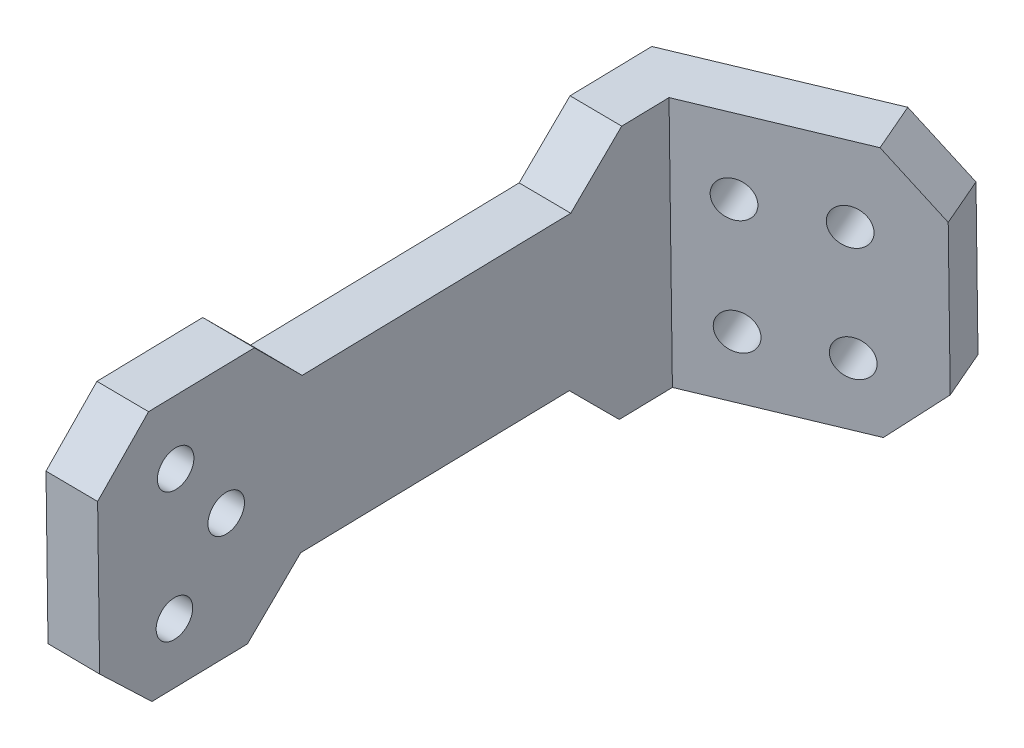
ISO-10303-21;
HEADER;
FILE_DESCRIPTION(('STEP AP214'),'2;1');
FILE_NAME('part.step','',(''),(''),'','','');
FILE_SCHEMA(('AUTOMOTIVE_DESIGN { 1 0 10303 214 1 1 1 1 }'));
ENDSEC;
DATA;
#1=APPLICATION_CONTEXT('core data for automotive mechanical design processes');
#2=APPLICATION_PROTOCOL_DEFINITION('international standard','automotive_design',2000,#1);
#3=PRODUCT_CONTEXT('',#1,'mechanical');
#4=PRODUCT('Part','Part','',(#3));
#5=PRODUCT_RELATED_PRODUCT_CATEGORY('part','',(#4));
#6=PRODUCT_DEFINITION_FORMATION('','',#4);
#7=PRODUCT_DEFINITION_CONTEXT('part definition',#1,'design');
#8=PRODUCT_DEFINITION('design','',#6,#7);
#9=PRODUCT_DEFINITION_SHAPE('','',#8);
#10=(LENGTH_UNIT() NAMED_UNIT(*) SI_UNIT(.MILLI.,.METRE.));
#11=(NAMED_UNIT(*) PLANE_ANGLE_UNIT() SI_UNIT($,.RADIAN.));
#12=(NAMED_UNIT(*) SI_UNIT($,.STERADIAN.) SOLID_ANGLE_UNIT());
#13=UNCERTAINTY_MEASURE_WITH_UNIT(LENGTH_MEASURE(1.E-05),#10,'distance_accuracy_value','');
#14=(GEOMETRIC_REPRESENTATION_CONTEXT(3) GLOBAL_UNCERTAINTY_ASSIGNED_CONTEXT((#13)) GLOBAL_UNIT_ASSIGNED_CONTEXT((#10,
#11,#12)) REPRESENTATION_CONTEXT('',''));
#15=CARTESIAN_POINT('',(0.,0.,0.));
#16=DIRECTION('',(0.,0.,1.));
#17=DIRECTION('',(1.,0.,0.));
#18=AXIS2_PLACEMENT_3D('',#15,#16,#17);
#19=CARTESIAN_POINT('',(0.677625199987656,71.7125158688856,1.62510661202803));
#20=DIRECTION('',(-0.00944634334495136,-0.999698722892989,-0.0226545810717298));
#21=DIRECTION('',(0.,-0.0226555919120575,0.999743329137591));
#22=AXIS2_PLACEMENT_3D('',#19,#20,#21);
#23=PLANE('',#22);
#24=DIRECTION('',(0.,0.0226555919120575,-0.999743329137591));
#25=VECTOR('',#24,1.);
#26=CARTESIAN_POINT('',(-79.7096790930301,74.4273959437813,-84.6574894141304));
#27=LINE('',#26,#25);
#28=CARTESIAN_POINT('',(-79.7096790930301,72.8806724105701,-16.403852945465));
#29=VERTEX_POINT('',#28);
#30=CARTESIAN_POINT('',(-79.7096790930301,73.1756143071616,-29.4190147097265));
#31=VERTEX_POINT('',#30);
#32=EDGE_CURVE('E297',#29,#31,#27,.T.);
#33=ORIENTED_EDGE('',*,*,#32,.F.);
#34=DIRECTION('',(-0.999955382303335,0.0094439187438584,0.000214012499884351));
#35=VECTOR('',#34,1.);
#36=CARTESIAN_POINT('',(-79.7096790930301,72.8806724105701,-16.403852945465));
#37=LINE('',#36,#35);
#38=CARTESIAN_POINT('',(-73.359962415404,72.8207035265466,-16.4052119248392));
#39=VERTEX_POINT('',#38);
#40=EDGE_CURVE('E252',#39,#29,#37,.T.);
#41=ORIENTED_EDGE('',*,*,#40,.F.);
#42=DIRECTION('',(0.,-0.0226555919120574,0.999743329137591));
#43=VECTOR('',#42,1.);
#44=CARTESIAN_POINT('',(-73.359962415404,72.676840517905,-10.0568417848155));
#45=LINE('',#44,#43);
#46=CARTESIAN_POINT('',(-73.359962415404,73.1156454231381,-29.4203736891007));
#47=VERTEX_POINT('',#46);
#48=EDGE_CURVE('E190',#47,#39,#45,.T.);
#49=ORIENTED_EDGE('',*,*,#48,.F.);
#50=DIRECTION('',(0.999955382303335,-0.00944391874385843,-0.000214012499883211));
#51=VECTOR('',#50,1.);
#52=CARTESIAN_POINT('',(0.677625199987693,72.4164092634002,-29.4362193653092));
#53=LINE('',#52,#51);
#54=EDGE_CURVE('E11',#31,#47,#53,.T.);
#55=ORIENTED_EDGE('',*,*,#54,.F.);
#56=EDGE_LOOP('',(#33,#41,#49,#55));
#57=FACE_BOUND('',#56,.T.);
#58=ADVANCED_FACE('F41',(#57),#23,.F.);
#59=CARTESIAN_POINT('',(-14.6991602759016,44.2871439133381,-167.493261540189));
#60=DIRECTION('',(0.00944634334495239,0.999698722892989,0.0226545810717298));
#61=DIRECTION('',(-0.999955376576697,0.00944634334495237,0.000107017596546688));
#62=AXIS2_PLACEMENT_3D('',#59,#60,#61);
#63=PLANE('',#62);
#64=DIRECTION('',(0.,-0.0226555919120575,0.999743329137591));
#65=VECTOR('',#64,1.);
#66=CARTESIAN_POINT('',(-80.0062344739473,43.0431846417096,-85.3686998448665));
#67=LINE('',#66,#65);
#68=CARTESIAN_POINT('',(-80.0062344739473,43.0431846417095,-85.3686998448665));
#69=VERTEX_POINT('',#68);
#70=CARTESIAN_POINT('',(-80.0062344739473,42.7991965757842,-74.6020228035035));
#71=VERTEX_POINT('',#70);
#72=EDGE_CURVE('E217',#69,#71,#67,.T.);
#73=ORIENTED_EDGE('',*,*,#72,.F.);
#74=DIRECTION('',(-0.922976587647694,0.,0.384856101230341));
#75=VECTOR('',#74,1.);
#76=CARTESIAN_POINT('',(-80.0062344739473,43.0431846417096,-85.3686998448665));
#77=LINE('',#76,#75);
#78=CARTESIAN_POINT('',(-57.7826837764154,43.0431846417096,-94.635315262214));
#79=VERTEX_POINT('',#78);
#80=EDGE_CURVE('E213',#79,#69,#77,.T.);
#81=ORIENTED_EDGE('',*,*,#80,.F.);
#82=DIRECTION('',(-0.384740152897546,0.0245451308027948,-0.922698515931529));
#83=VECTOR('',#82,1.);
#84=CARTESIAN_POINT('',(-57.7826837764154,43.0431846417096,-94.635315262214));
#85=LINE('',#84,#83);
#86=CARTESIAN_POINT('',(-55.339583805516,42.8873230611118,-88.7761796860488));
#87=VERTEX_POINT('',#86);
#88=EDGE_CURVE('E216',#87,#79,#85,.T.);
#89=ORIENTED_EDGE('',*,*,#88,.F.);
#90=DIRECTION('',(0.922976587647695,0.,-0.38485610123034));
#91=VECTOR('',#90,1.);
#92=CARTESIAN_POINT('',(-49.4786824739531,42.8873230611118,-91.2200159288615));
#93=LINE('',#92,#91);
#94=CARTESIAN_POINT('',(-73.6565177963211,42.8873230611118,-81.1385170448318));
#95=VERTEX_POINT('',#94);
#96=EDGE_CURVE('E203',#95,#87,#93,.T.);
#97=ORIENTED_EDGE('',*,*,#96,.F.);
#98=DIRECTION('',(0.,0.0226555919120575,-0.999743329137591));
#99=VECTOR('',#98,1.);
#100=CARTESIAN_POINT('',(-73.6565177963211,41.2926292158333,-10.7680522155516));
#101=LINE('',#100,#99);
#102=CARTESIAN_POINT('',(-73.6565177963211,42.7392276917607,-74.6033817828778));
#103=VERTEX_POINT('',#102);
#104=EDGE_CURVE('E285',#103,#95,#101,.T.);
#105=ORIENTED_EDGE('',*,*,#104,.F.);
#106=DIRECTION('',(0.999955382303335,-0.00944391874385943,-0.000214012499884219));
#107=VECTOR('',#106,1.);
#108=CARTESIAN_POINT('',(-14.6991602759016,42.1824143542566,-74.6159999573412));
#109=LINE('',#108,#107);
#110=EDGE_CURVE('E174',#71,#103,#109,.T.);
#111=ORIENTED_EDGE('',*,*,#110,.F.);
#112=EDGE_LOOP('',(#73,#81,#89,#97,#105,#111));
#113=FACE_BOUND('',#112,.T.);
#114=ADVANCED_FACE('F286',(#113),#63,.F.);
#115=CARTESIAN_POINT('',(-80.8710501892957,-48.4795490342398,-87.4427338938127));
#116=DIRECTION('',(-0.999955382303335,0.00944391874385943,0.000214012499884421));
#117=DIRECTION('',(-0.00944391896013155,-0.999955405202989,0.));
#118=AXIS2_PLACEMENT_3D('',#115,#116,#117);
#119=PLANE('',#118);
#120=DIRECTION('',(-0.00682918207909545,-0.707073818757855,-0.707106764993317));
#121=VECTOR('',#120,1.);
#122=CARTESIAN_POINT('',(-80.5773681736715,-16.662410896713,-119.261225933014));
#123=LINE('',#122,#121);
#124=CARTESIAN_POINT('',(-79.766958551444,67.2450643631087,-35.3498409888518));
#125=VERTEX_POINT('',#124);
#126=EDGE_CURVE('E324',#31,#125,#123,.T.);
#127=ORIENTED_EDGE('',*,*,#126,.T.);
#128=DIRECTION('',(0.,0.0226555919120577,-0.999743329137591));
#129=VECTOR('',#128,1.);
#130=CARTESIAN_POINT('',(-79.766958551444,68.365558115815,-84.7948591970185));
#131=LINE('',#130,#129);
#132=CARTESIAN_POINT('',(-79.766958551444,67.9939408277113,-68.3961746596216));
#133=VERTEX_POINT('',#132);
#134=EDGE_CURVE('E323',#125,#133,#131,.T.);
#135=ORIENTED_EDGE('',*,*,#134,.T.);
#136=DIRECTION('',(0.00652653619627499,0.707076677048495,-0.707106764993334));
#137=VECTOR('',#136,1.);
#138=CARTESIAN_POINT('',(-80.2166038918847,19.2799333346451,-19.6800942593051));
#139=LINE('',#138,#137);
#140=CARTESIAN_POINT('',(-79.7096790930301,74.1995249079103,-74.6020228035036));
#141=VERTEX_POINT('',#140);
#142=EDGE_CURVE('E321',#133,#141,#139,.T.);
#143=ORIENTED_EDGE('',*,*,#142,.T.);
#144=CARTESIAN_POINT('',(-79.7096790930301,74.4273959437813,-84.6574894141304));
#145=VERTEX_POINT('',#144);
#146=EDGE_CURVE('E172',#141,#145,#27,.T.);
#147=ORIENTED_EDGE('',*,*,#146,.T.);
#148=DIRECTION('',(0.00944634334495239,0.999698722892989,0.0226545810717298));
#149=VECTOR('',#148,1.);
#150=CARTESIAN_POINT('',(-80.8710501892957,-48.4795490342398,-87.4427338938127));
#151=LINE('',#150,#149);
#152=EDGE_CURVE('E189',#69,#145,#151,.T.);
#153=ORIENTED_EDGE('',*,*,#152,.F.);
#154=ORIENTED_EDGE('',*,*,#72,.T.);
#155=DIRECTION('',(0.00682918207909539,0.707073818757849,0.707106764993324));
#156=VECTOR('',#155,1.);
#157=CARTESIAN_POINT('',(-80.509043049518,-9.26015336031544,-126.66379845465));
#158=LINE('',#157,#156);
#159=CARTESIAN_POINT('',(-79.9462988757775,49.0047555704962,-68.3961746596215));
#160=VERTEX_POINT('',#159);
#161=EDGE_CURVE('E280',#71,#160,#158,.T.);
#162=ORIENTED_EDGE('',*,*,#161,.T.);
#163=DIRECTION('',(0.,-0.0226555919120575,0.999743329137591));
#164=VECTOR('',#163,1.);
#165=CARTESIAN_POINT('',(-79.9462988757775,49.3861195487064,-85.2249600062605));
#166=LINE('',#165,#164);
#167=CARTESIAN_POINT('',(-79.9462988757775,48.2558791058935,-35.3498409888517));
#168=VERTEX_POINT('',#167);
#169=EDGE_CURVE('E326',#160,#168,#166,.T.);
#170=ORIENTED_EDGE('',*,*,#169,.T.);
#171=DIRECTION('',(-0.00652653619627508,-0.707076677048504,0.707106764993325));
#172=VECTOR('',#171,1.);
#173=CARTESIAN_POINT('',(-80.1523426907388,25.9333527875086,-13.0263647891287));
#174=LINE('',#173,#172);
#175=CARTESIAN_POINT('',(-80.0062344739472,41.7625322039023,-28.8562177781239));
#176=VERTEX_POINT('',#175);
#177=EDGE_CURVE('E328',#168,#176,#174,.T.);
#178=ORIENTED_EDGE('',*,*,#177,.T.);
#179=CARTESIAN_POINT('',(-80.0062344739473,41.4964611084984,-17.115063376201));
#180=VERTEX_POINT('',#179);
#181=EDGE_CURVE('E292',#176,#180,#67,.T.);
#182=ORIENTED_EDGE('',*,*,#181,.T.);
#183=DIRECTION('',(-0.00667957343663225,-0.690873823428353,-0.722944495379966));
#184=VECTOR('',#183,1.);
#185=CARTESIAN_POINT('',(-80.761098739098,-36.5797762413307,-98.815634591854));
#186=LINE('',#185,#184);
#187=CARTESIAN_POINT('',(-79.9462501937068,47.7006849902273,-10.6228366463719));
#188=VERTEX_POINT('',#187);
#189=EDGE_CURVE('E247',#188,#180,#186,.T.);
#190=ORIENTED_EDGE('',*,*,#189,.F.);
#191=DIRECTION('',(0.00944634334495239,0.999698722892989,0.0226545810717298));
#192=VECTOR('',#191,1.);
#193=CARTESIAN_POINT('',(-80.8710501892957,-50.1701355760925,-12.8407272851236));
#194=LINE('',#193,#192);
#195=CARTESIAN_POINT('',(-79.7696633732706,66.388722511558,-10.1993393952467));
#196=VERTEX_POINT('',#195);
#197=EDGE_CURVE('E200',#188,#196,#194,.T.);
#198=ORIENTED_EDGE('',*,*,#197,.T.);
#199=DIRECTION('',(-0.00667957343663226,-0.722913668773976,0.690906079578444));
#200=VECTOR('',#199,1.);
#201=CARTESIAN_POINT('',(-79.9679082336864,44.9331728842632,10.3062483650945));
#202=LINE('',#201,#200);
#203=EDGE_CURVE('E244',#29,#196,#202,.T.);
#204=ORIENTED_EDGE('',*,*,#203,.F.);
#205=ORIENTED_EDGE('',*,*,#32,.T.);
#206=EDGE_LOOP('',(#127,#135,#143,#147,#153,#154,#162,#170,#178,#182,#190,#198,#204,#205));
#207=FACE_BOUND('',#206,.T.);
#208=CARTESIAN_POINT('',(-79.9357155551836,49.0243422093975,-19.810817403018));
#209=DIRECTION('',(0.999955382303335,-0.00944391874385943,-0.000214012499884421));
#210=DIRECTION('',(-0.00944391896013155,-0.999955405202989,0.));
#211=AXIS2_PLACEMENT_3D('',#208,#209,#210);
#212=CIRCLE('',#211,2.2479);
#213=CARTESIAN_POINT('',(-79.956944540614,46.7765424540417,-19.810817403018));
#214=VERTEX_POINT('',#213);
#215=EDGE_CURVE('E350',#214,#214,#212,.T.);
#216=ORIENTED_EDGE('',*,*,#215,.T.);
#217=EDGE_LOOP('',(#216));
#218=FACE_BOUND('',#217,.T.);
#219=CARTESIAN_POINT('',(-79.7842211516335,65.0651032882848,-19.8108174030179));
#220=DIRECTION('',(0.999955382303335,-0.00944391874385943,-0.000214012499884421));
#221=DIRECTION('',(-0.00944391896013155,-0.999955405202989,0.));
#222=AXIS2_PLACEMENT_3D('',#219,#220,#221);
#223=CIRCLE('',#222,2.2479);
#224=CARTESIAN_POINT('',(-79.805450137064,62.817303532929,-19.8108174030179));
#225=VERTEX_POINT('',#224);
#226=EDGE_CURVE('E347',#225,#225,#223,.T.);
#227=ORIENTED_EDGE('',*,*,#226,.T.);
#228=EDGE_LOOP('',(#227));
#229=FACE_BOUND('',#228,.T.);
#230=CARTESIAN_POINT('',(-79.8603841444811,57.143350836971,-26.105814993145));
#231=DIRECTION('',(0.999955382303335,-0.00944391874385943,-0.000214012499884421));
#232=DIRECTION('',(-0.00944391896013155,-0.999955405202989,0.));
#233=AXIS2_PLACEMENT_3D('',#230,#231,#232);
#234=CIRCLE('',#233,2.2479);
#235=CARTESIAN_POINT('',(-79.8816131299115,54.8955510816152,-26.105814993145));
#236=VERTEX_POINT('',#235);
#237=EDGE_CURVE('E339',#236,#236,#234,.T.);
#238=ORIENTED_EDGE('',*,*,#237,.T.);
#239=EDGE_LOOP('',(#238));
#240=FACE_BOUND('',#239,.T.);
#241=ADVANCED_FACE('F318',(#207,#218,#229,#240),#119,.T.);
#242=CARTESIAN_POINT('',(-80.8710501892957,-50.1701355760925,-12.8407272851236));
#243=DIRECTION('',(0.,-0.0226555919120575,0.999743329137591));
#244=DIRECTION('',(0.,0.999743329137591,0.0226555919120575));
#245=AXIS2_PLACEMENT_3D('',#242,#243,#244);
#246=PLANE('',#245);
#247=DIRECTION('',(0.00944634334495239,0.999698722892989,0.0226545810717298));
#248=VECTOR('',#247,1.);
#249=CARTESIAN_POINT('',(-74.5213335116696,-50.230104460116,-12.8420862644978));
#250=LINE('',#249,#248);
#251=CARTESIAN_POINT('',(-73.5965335160806,47.6407161062038,-10.6241956257461));
#252=VERTEX_POINT('',#251);
#253=CARTESIAN_POINT('',(-73.4199466956444,66.3287536275345,-10.200698374621));
#254=VERTEX_POINT('',#253);
#255=EDGE_CURVE('E204',#252,#254,#250,.T.);
#256=ORIENTED_EDGE('',*,*,#255,.T.);
#257=DIRECTION('',(0.999955382303335,-0.0094439187438584,-0.000214012499884351));
#258=VECTOR('',#257,1.);
#259=CARTESIAN_POINT('',(-73.4199466956444,66.3287536275345,-10.200698374621));
#260=LINE('',#259,#258);
#261=EDGE_CURVE('E239',#196,#254,#260,.T.);
#262=ORIENTED_EDGE('',*,*,#261,.F.);
#263=ORIENTED_EDGE('',*,*,#197,.F.);
#264=DIRECTION('',(-0.999955382303335,0.00944391874385943,0.000214012499884375));
#265=VECTOR('',#264,1.);
#266=CARTESIAN_POINT('',(-79.9462501937068,47.7006849902273,-10.6228366463719));
#267=LINE('',#266,#265);
#268=EDGE_CURVE('E242',#252,#188,#267,.T.);
#269=ORIENTED_EDGE('',*,*,#268,.F.);
#270=EDGE_LOOP('',(#256,#262,#263,#269));
#271=FACE_BOUND('',#270,.T.);
#272=ADVANCED_FACE('F405',(#271),#246,.T.);
#273=CARTESIAN_POINT('',(-74.5213335116696,-50.230104460116,-12.8420862644978));
#274=DIRECTION('',(0.999955382303335,-0.00944391874385944,-0.000214012499884224));
#275=DIRECTION('',(0.00944391896013156,0.999955405202989,0.));
#276=AXIS2_PLACEMENT_3D('',#273,#274,#275);
#277=PLANE('',#276);
#278=DIRECTION('',(0.00682918207909528,0.707073818757855,0.707106764993317));
#279=VECTOR('',#278,1.);
#280=CARTESIAN_POINT('',(-73.4172418738179,67.1850954790851,-35.3511999682261));
#281=LINE('',#280,#279);
#282=CARTESIAN_POINT('',(-73.4172418738179,67.1850954790851,-35.3511999682261));
#283=VERTEX_POINT('',#282);
#284=EDGE_CURVE('E494',#283,#47,#281,.T.);
#285=ORIENTED_EDGE('',*,*,#284,.T.);
#286=ORIENTED_EDGE('',*,*,#48,.T.);
#287=DIRECTION('',(0.0066795734366324,0.722913668773976,-0.690906079578444));
#288=VECTOR('',#287,1.);
#289=CARTESIAN_POINT('',(-73.970640103657,6.7285717098195,46.7606371341771));
#290=LINE('',#289,#288);
#291=EDGE_CURVE('E235',#254,#39,#290,.T.);
#292=ORIENTED_EDGE('',*,*,#291,.F.);
#293=ORIENTED_EDGE('',*,*,#255,.F.);
#294=DIRECTION('',(0.00667957343663211,0.690873823428353,0.722944495379966));
#295=VECTOR('',#294,1.);
#296=CARTESIAN_POINT('',(-74.0589335138751,-0.185699376786717,-60.670734710996));
#297=LINE('',#296,#295);
#298=CARTESIAN_POINT('',(-73.6565177963211,41.4364922244749,-17.1164223555753));
#299=VERTEX_POINT('',#298);
#300=EDGE_CURVE('E237',#299,#252,#297,.T.);
#301=ORIENTED_EDGE('',*,*,#300,.F.);
#302=CARTESIAN_POINT('',(-73.6565177963211,41.7025633198788,-28.8575767574982));
#303=VERTEX_POINT('',#302);
#304=EDGE_CURVE('E289',#299,#303,#101,.T.);
#305=ORIENTED_EDGE('',*,*,#304,.T.);
#306=DIRECTION('',(0.00652653619627541,0.707076677048504,-0.707106764993324));
#307=VECTOR('',#306,1.);
#308=CARTESIAN_POINT('',(-73.5965821981513,48.19591022187,-35.3511999682259));
#309=LINE('',#308,#307);
#310=CARTESIAN_POINT('',(-73.5965821981513,48.19591022187,-35.3511999682259));
#311=VERTEX_POINT('',#310);
#312=EDGE_CURVE('E481',#303,#311,#309,.T.);
#313=ORIENTED_EDGE('',*,*,#312,.T.);
#314=DIRECTION('',(0.,0.0226555919120575,-0.999743329137591));
#315=VECTOR('',#314,1.);
#316=CARTESIAN_POINT('',(-73.5965821981513,48.9447866864727,-68.3975336389957));
#317=LINE('',#316,#315);
#318=CARTESIAN_POINT('',(-73.5965821981513,48.9447866864727,-68.3975336389957));
#319=VERTEX_POINT('',#318);
#320=EDGE_CURVE('E483',#311,#319,#317,.T.);
#321=ORIENTED_EDGE('',*,*,#320,.T.);
#322=DIRECTION('',(-0.00682918207909415,-0.707073818757849,-0.707106764993324));
#323=VECTOR('',#322,1.);
#324=CARTESIAN_POINT('',(-73.6565177963211,42.7392276917607,-74.6033817828778));
#325=LINE('',#324,#323);
#326=EDGE_CURVE('E277',#319,#103,#325,.T.);
#327=ORIENTED_EDGE('',*,*,#326,.T.);
#328=ORIENTED_EDGE('',*,*,#104,.T.);
#329=DIRECTION('',(0.00944634334495239,0.999698722892989,0.0226545810717298));
#330=VECTOR('',#329,1.);
#331=CARTESIAN_POINT('',(-74.5213335116696,-48.6354106148375,-83.2125510937781));
#332=LINE('',#331,#330);
#333=CARTESIAN_POINT('',(-73.3599624154039,74.2715343631835,-80.4273066140957));
#334=VERTEX_POINT('',#333);
#335=EDGE_CURVE('E188',#95,#334,#332,.T.);
#336=ORIENTED_EDGE('',*,*,#335,.T.);
#337=CARTESIAN_POINT('',(-73.3599624154039,74.1395560238868,-74.6033817828779));
#338=VERTEX_POINT('',#337);
#339=EDGE_CURVE('E169',#334,#338,#45,.T.);
#340=ORIENTED_EDGE('',*,*,#339,.T.);
#341=DIRECTION('',(-0.00652653619627642,-0.707076677048495,0.707106764993333));
#342=VECTOR('',#341,1.);
#343=CARTESIAN_POINT('',(-73.3599624154039,74.1395560238868,-74.6033817828779));
#344=LINE('',#343,#342);
#345=CARTESIAN_POINT('',(-73.4172418738179,67.9339719436878,-68.3975336389958));
#346=VERTEX_POINT('',#345);
#347=EDGE_CURVE('E176',#338,#346,#344,.T.);
#348=ORIENTED_EDGE('',*,*,#347,.T.);
#349=DIRECTION('',(0.,-0.0226555919120577,0.999743329137591));
#350=VECTOR('',#349,1.);
#351=CARTESIAN_POINT('',(-73.4172418738179,67.9339719436878,-68.3975336389958));
#352=LINE('',#351,#350);
#353=EDGE_CURVE('E182',#346,#283,#352,.T.);
#354=ORIENTED_EDGE('',*,*,#353,.T.);
#355=EDGE_LOOP('',(#285,#286,#292,#293,#301,#305,#313,#321,#327,#328,#336,#340,#348,#354));
#356=FACE_BOUND('',#355,.T.);
#357=CARTESIAN_POINT('',(-73.5859988775574,48.964373325374,-19.8121763823922));
#358=DIRECTION('',(-0.999955382303335,0.00944391874385944,0.000214012499884215));
#359=DIRECTION('',(0.00944391896013156,0.999955405202989,0.));
#360=AXIS2_PLACEMENT_3D('',#357,#358,#359);
#361=CIRCLE('',#360,2.2479);
#362=CARTESIAN_POINT('',(-73.5647698921269,51.2121730807298,-19.8121763823922));
#363=VERTEX_POINT('',#362);
#364=EDGE_CURVE('E336',#363,#363,#361,.T.);
#365=ORIENTED_EDGE('',*,*,#364,.T.);
#366=EDGE_LOOP('',(#365));
#367=FACE_BOUND('',#366,.T.);
#368=CARTESIAN_POINT('',(-73.4345044740074,65.0051344042613,-19.8121763823921));
#369=DIRECTION('',(-0.999955382303335,0.00944391874385944,0.000214012499884215));
#370=DIRECTION('',(0.00944391896013156,0.999955405202989,0.));
#371=AXIS2_PLACEMENT_3D('',#368,#369,#370);
#372=CIRCLE('',#371,2.2479);
#373=CARTESIAN_POINT('',(-73.4132754885769,67.2529341596171,-19.8121763823921));
#374=VERTEX_POINT('',#373);
#375=EDGE_CURVE('E340',#374,#374,#372,.T.);
#376=ORIENTED_EDGE('',*,*,#375,.T.);
#377=EDGE_LOOP('',(#376));
#378=FACE_BOUND('',#377,.T.);
#379=CARTESIAN_POINT('',(-73.5106674668549,57.0833819529475,-26.1071739725193));
#380=DIRECTION('',(-0.999955382303335,0.00944391874385944,0.000214012499884215));
#381=DIRECTION('',(0.00944391896013156,0.999955405202989,0.));
#382=AXIS2_PLACEMENT_3D('',#379,#380,#381);
#383=CIRCLE('',#382,2.2479);
#384=CARTESIAN_POINT('',(-73.4894384814244,59.3311817083033,-26.1071739725193));
#385=VERTEX_POINT('',#384);
#386=EDGE_CURVE('E335',#385,#385,#383,.T.);
#387=ORIENTED_EDGE('',*,*,#386,.T.);
#388=EDGE_LOOP('',(#387));
#389=FACE_BOUND('',#388,.T.);
#390=ADVANCED_FACE('F185',(#356,#367,#378,#389),#277,.T.);
#391=CARTESIAN_POINT('',(-50.3434981893016,-48.6354106148375,-93.2940499778077));
#392=DIRECTION('',(0.384740152897546,-0.0245451308027948,0.922698515931529));
#393=DIRECTION('',(-0.922976587647695,0.,0.38485610123034));
#394=AXIS2_PLACEMENT_3D('',#391,#392,#393);
#395=PLANE('',#394);
#396=CARTESIAN_POINT('',(-57.8117036717517,50.7250680491896,-87.5368775396771));
#397=DIRECTION('',(-0.384740152897547,0.0245451308027948,-0.922698515931529));
#398=DIRECTION('',(-0.922976587647694,0.,0.384856101230341));
#399=AXIS2_PLACEMENT_3D('',#396,#397,#398);
#400=CIRCLE('',#399,2.24789999999999);
#401=CARTESIAN_POINT('',(-59.886462743125,50.7250680491896,-86.6717595097214));
#402=VERTEX_POINT('',#401);
#403=EDGE_CURVE('E357',#402,#402,#400,.T.);
#404=ORIENTED_EDGE('',*,*,#403,.T.);
#405=EDGE_LOOP('',(#404));
#406=FACE_BOUND('',#405,.T.);
#407=CARTESIAN_POINT('',(-67.8938108719946,64.9010363431659,-82.9558119057789));
#408=DIRECTION('',(-0.384740152897547,0.0245451308027948,-0.922698515931529));
#409=DIRECTION('',(-0.922976587647694,0.,0.384856101230341));
#410=AXIS2_PLACEMENT_3D('',#407,#408,#409);
#411=CIRCLE('',#410,2.2479);
#412=CARTESIAN_POINT('',(-69.9685699433679,64.9010363431659,-82.0906938758232));
#413=VERTEX_POINT('',#412);
#414=EDGE_CURVE('E356',#413,#413,#411,.T.);
#415=ORIENTED_EDGE('',*,*,#414,.T.);
#416=EDGE_LOOP('',(#415));
#417=FACE_BOUND('',#416,.T.);
#418=CARTESIAN_POINT('',(-67.8938108719946,50.6133155314965,-83.335886188051));
#419=DIRECTION('',(-0.384740152897547,0.0245451308027948,-0.922698515931529));
#420=DIRECTION('',(-0.922976587647694,0.,0.384856101230341));
#421=AXIS2_PLACEMENT_3D('',#418,#419,#420);
#422=CIRCLE('',#421,2.24790000000001);
#423=CARTESIAN_POINT('',(-69.9685699433679,50.6133155314965,-82.4707681580953));
#424=VERTEX_POINT('',#423);
#425=EDGE_CURVE('E353',#424,#424,#422,.T.);
#426=ORIENTED_EDGE('',*,*,#425,.T.);
#427=EDGE_LOOP('',(#426));
#428=FACE_BOUND('',#427,.T.);
#429=CARTESIAN_POINT('',(-57.8117036717517,64.9010363431659,-87.1597760379145));
#430=DIRECTION('',(-0.384740152897547,0.0245451308027948,-0.922698515931529));
#431=DIRECTION('',(-0.922976587647694,0.,0.384856101230341));
#432=AXIS2_PLACEMENT_3D('',#429,#430,#431);
#433=CIRCLE('',#432,2.24790000000001);
#434=CARTESIAN_POINT('',(-59.886462743125,64.9010363431659,-86.2946580079588));
#435=VERTEX_POINT('',#434);
#436=EDGE_CURVE('E222',#435,#435,#433,.T.);
#437=ORIENTED_EDGE('',*,*,#436,.T.);
#438=EDGE_LOOP('',(#437));
#439=FACE_BOUND('',#438,.T.);
#440=DIRECTION('',(0.00944634334495239,0.999698722892989,0.0226545810717298));
#441=VECTOR('',#440,1.);
#442=CARTESIAN_POINT('',(-50.3434981893016,-48.6354106148375,-93.2940499778077));
#443=LINE('',#442,#441);
#444=CARTESIAN_POINT('',(-49.4186981937127,49.2354099514823,-91.076159339056));
#445=VERTEX_POINT('',#444);
#446=CARTESIAN_POINT('',(-49.2421113732764,67.923447472813,-90.6526620879308));
#447=VERTEX_POINT('',#446);
#448=EDGE_CURVE('E208',#445,#447,#443,.T.);
#449=ORIENTED_EDGE('',*,*,#448,.T.);
#450=DIRECTION('',(0.645963430565471,-0.706893746101166,-0.28815356686175));
#451=VECTOR('',#450,1.);
#452=CARTESIAN_POINT('',(4.01395451241442,9.6440184289875,-114.409309315704));
#453=LINE('',#452,#451);
#454=CARTESIAN_POINT('',(-55.0430284245989,74.2715343631835,-88.0649692553127));
#455=VERTEX_POINT('',#454);
#456=EDGE_CURVE('E265',#455,#447,#453,.T.);
#457=ORIENTED_EDGE('',*,*,#456,.F.);
#458=DIRECTION('',(-0.922976587647694,0.,0.38485610123034));
#459=VECTOR('',#458,1.);
#460=CARTESIAN_POINT('',(-49.182127093036,74.2715343631835,-90.5088054981254));
#461=LINE('',#460,#459);
#462=EDGE_CURVE('E196',#455,#334,#461,.T.);
#463=ORIENTED_EDGE('',*,*,#462,.T.);
#464=ORIENTED_EDGE('',*,*,#335,.F.);
#465=ORIENTED_EDGE('',*,*,#96,.T.);
#466=DIRECTION('',(-0.659322577438735,-0.706893746101166,0.256115151060229));
#467=VECTOR('',#466,1.);
#468=CARTESIAN_POINT('',(-95.0609478441965,0.299999668322178,-73.3463377555557));
#469=LINE('',#468,#467);
#470=EDGE_CURVE('E268',#445,#87,#469,.T.);
#471=ORIENTED_EDGE('',*,*,#470,.F.);
#472=EDGE_LOOP('',(#449,#457,#463,#464,#465,#471));
#473=FACE_BOUND('',#472,.T.);
#474=ADVANCED_FACE('F304',(#406,#417,#428,#439,#473),#395,.T.);
#475=CARTESIAN_POINT('',(-52.786598160201,-48.4795490342398,-99.1531855539729));
#476=DIRECTION('',(0.922976587647694,0.,-0.38485610123034));
#477=DIRECTION('',(0.38485610123034,0.,0.922976587647694));
#478=AXIS2_PLACEMENT_3D('',#475,#476,#477);
#479=PLANE('',#478);
#480=DIRECTION('',(0.00944634334495239,0.999698722892989,0.0226545810717298));
#481=VECTOR('',#480,1.);
#482=CARTESIAN_POINT('',(-52.786598160201,-48.4795490342398,-99.1531855539729));
#483=LINE('',#482,#481);
#484=CARTESIAN_POINT('',(-51.8617981646121,49.39127153208,-96.9352949152212));
#485=VERTEX_POINT('',#484);
#486=CARTESIAN_POINT('',(-51.6852113441758,68.0793090534108,-96.511797664096));
#487=VERTEX_POINT('',#486);
#488=EDGE_CURVE('E193',#485,#487,#483,.T.);
#489=ORIENTED_EDGE('',*,*,#488,.T.);
#490=DIRECTION('',(-0.384740152897546,0.0245451308027944,-0.922698515931529));
#491=VECTOR('',#490,1.);
#492=CARTESIAN_POINT('',(-51.6852113441758,68.0793090534108,-96.511797664096));
#493=LINE('',#492,#491);
#494=EDGE_CURVE('E260',#447,#487,#493,.T.);
#495=ORIENTED_EDGE('',*,*,#494,.F.);
#496=ORIENTED_EDGE('',*,*,#448,.F.);
#497=DIRECTION('',(0.384740152897546,-0.0245451308027948,0.922698515931529));
#498=VECTOR('',#497,1.);
#499=CARTESIAN_POINT('',(-49.4186981937127,49.2354099514823,-91.076159339056));
#500=LINE('',#499,#498);
#501=EDGE_CURVE('E263',#485,#445,#500,.T.);
#502=ORIENTED_EDGE('',*,*,#501,.F.);
#503=EDGE_LOOP('',(#489,#495,#496,#502));
#504=FACE_BOUND('',#503,.T.);
#505=ADVANCED_FACE('F310',(#504),#479,.T.);
#506=CARTESIAN_POINT('',(-80.8710501892957,-48.4795490342398,-87.4427338938127));
#507=DIRECTION('',(-0.384740152897546,0.0245451308027948,-0.922698515931529));
#508=DIRECTION('',(0.922976587647694,0.,-0.38485610123034));
#509=AXIS2_PLACEMENT_3D('',#506,#507,#508);
#510=PLANE('',#509);
#511=CARTESIAN_POINT('',(-60.2548036426511,50.8809296297874,-93.3960131158423));
#512=DIRECTION('',(0.384740152897546,-0.0245451308027948,0.922698515931529));
#513=DIRECTION('',(0.922976587647694,0.,-0.38485610123034));
#514=AXIS2_PLACEMENT_3D('',#511,#512,#513);
#515=CIRCLE('',#514,2.24789999999999);
#516=CARTESIAN_POINT('',(-58.1800445712779,50.8809296297874,-94.261131145798));
#517=VERTEX_POINT('',#516);
#518=EDGE_CURVE('E228',#517,#517,#515,.T.);
#519=ORIENTED_EDGE('',*,*,#518,.T.);
#520=EDGE_LOOP('',(#519));
#521=FACE_BOUND('',#520,.T.);
#522=CARTESIAN_POINT('',(-70.336910842894,65.0568979237636,-88.8149474819441));
#523=DIRECTION('',(0.384740152897546,-0.0245451308027948,0.922698515931529));
#524=DIRECTION('',(0.922976587647694,0.,-0.38485610123034));
#525=AXIS2_PLACEMENT_3D('',#522,#523,#524);
#526=CIRCLE('',#525,2.2479);
#527=CARTESIAN_POINT('',(-68.2621517715208,65.0568979237636,-89.6800655118998));
#528=VERTEX_POINT('',#527);
#529=EDGE_CURVE('E225',#528,#528,#526,.T.);
#530=ORIENTED_EDGE('',*,*,#529,.T.);
#531=EDGE_LOOP('',(#530));
#532=FACE_BOUND('',#531,.T.);
#533=CARTESIAN_POINT('',(-70.336910842894,50.7691771120942,-89.1950217642162));
#534=DIRECTION('',(0.384740152897546,-0.0245451308027948,0.922698515931529));
#535=DIRECTION('',(0.922976587647694,0.,-0.38485610123034));
#536=AXIS2_PLACEMENT_3D('',#533,#534,#535);
#537=CIRCLE('',#536,2.24790000000001);
#538=CARTESIAN_POINT('',(-68.2621517715208,50.7691771120942,-90.0601397941719));
#539=VERTEX_POINT('',#538);
#540=EDGE_CURVE('E221',#539,#539,#537,.T.);
#541=ORIENTED_EDGE('',*,*,#540,.T.);
#542=EDGE_LOOP('',(#541));
#543=FACE_BOUND('',#542,.T.);
#544=CARTESIAN_POINT('',(-60.2548036426511,65.0568979237636,-93.0189116140797));
#545=DIRECTION('',(0.384740152897546,-0.0245451308027948,0.922698515931529));
#546=DIRECTION('',(0.922976587647694,0.,-0.38485610123034));
#547=AXIS2_PLACEMENT_3D('',#544,#545,#546);
#548=CIRCLE('',#547,2.24790000000001);
#549=CARTESIAN_POINT('',(-58.1800445712779,65.0568979237636,-93.8840296440354));
#550=VERTEX_POINT('',#549);
#551=EDGE_CURVE('E218',#550,#550,#548,.T.);
#552=ORIENTED_EDGE('',*,*,#551,.T.);
#553=EDGE_LOOP('',(#552));
#554=FACE_BOUND('',#553,.T.);
#555=ORIENTED_EDGE('',*,*,#80,.T.);
#556=ORIENTED_EDGE('',*,*,#152,.T.);
#557=DIRECTION('',(0.922976587647694,0.,-0.384856101230341));
#558=VECTOR('',#557,1.);
#559=CARTESIAN_POINT('',(-79.7096790930301,74.4273959437813,-84.6574894141304));
#560=LINE('',#559,#558);
#561=CARTESIAN_POINT('',(-57.4861283954983,74.4273959437813,-93.9241048314779));
#562=VERTEX_POINT('',#561);
#563=EDGE_CURVE('E299',#145,#562,#560,.T.);
#564=ORIENTED_EDGE('',*,*,#563,.T.);
#565=DIRECTION('',(-0.645963430565471,0.706893746101166,0.28815356686175));
#566=VECTOR('',#565,1.);
#567=CARTESIAN_POINT('',(-12.3276541891531,25.0093615946979,-114.0685507875));
#568=LINE('',#567,#566);
#569=EDGE_CURVE('E255',#487,#562,#568,.T.);
#570=ORIENTED_EDGE('',*,*,#569,.F.);
#571=ORIENTED_EDGE('',*,*,#488,.F.);
#572=DIRECTION('',(0.659322577438735,0.706893746101166,-0.256115151060229));
#573=VECTOR('',#572,1.);
#574=CARTESIAN_POINT('',(-111.689991113522,-14.7536203361927,-73.6949157759303));
#575=LINE('',#574,#573);
#576=EDGE_CURVE('E258',#79,#485,#575,.T.);
#577=ORIENTED_EDGE('',*,*,#576,.F.);
#578=EDGE_LOOP('',(#555,#556,#564,#570,#571,#577));
#579=FACE_BOUND('',#578,.T.);
#580=ADVANCED_FACE('F307',(#521,#532,#543,#554,#579),#510,.T.);
#581=ORIENTED_EDGE('',*,*,#339,.F.);
#582=ORIENTED_EDGE('',*,*,#462,.F.);
#583=DIRECTION('',(0.384740152897546,-0.0245451308027944,0.922698515931529));
#584=VECTOR('',#583,1.);
#585=CARTESIAN_POINT('',(-55.0430284245989,74.2715343631836,-88.0649692553127));
#586=LINE('',#585,#584);
#587=EDGE_CURVE('E250',#562,#455,#586,.T.);
#588=ORIENTED_EDGE('',*,*,#587,.F.);
#589=ORIENTED_EDGE('',*,*,#563,.F.);
#590=ORIENTED_EDGE('',*,*,#146,.F.);
#591=DIRECTION('',(-0.999955382303335,0.00944391874385838,0.000214012499885282));
#592=VECTOR('',#591,1.);
#593=CARTESIAN_POINT('',(0.677625199987589,73.4403198641489,-74.6192274590865));
#594=LINE('',#593,#592);
#595=EDGE_CURVE('E49',#338,#141,#594,.T.);
#596=ORIENTED_EDGE('',*,*,#595,.F.);
#597=EDGE_LOOP('',(#581,#582,#588,#589,#590,#596));
#598=FACE_BOUND('',#597,.T.);
#599=ADVANCED_FACE('F166',(#598),#23,.F.);
#600=ORIENTED_EDGE('',*,*,#304,.F.);
#601=DIRECTION('',(0.999955382303335,-0.00944391874385943,-0.000214012499884375));
#602=VECTOR('',#601,1.);
#603=CARTESIAN_POINT('',(-73.6565177963211,41.4364922244749,-17.1164223555753));
#604=LINE('',#603,#602);
#605=EDGE_CURVE('E233',#180,#299,#604,.T.);
#606=ORIENTED_EDGE('',*,*,#605,.F.);
#607=ORIENTED_EDGE('',*,*,#181,.F.);
#608=DIRECTION('',(-0.999955382303335,0.00944391874385943,0.000214012499884227));
#609=VECTOR('',#608,1.);
#610=CARTESIAN_POINT('',(-14.6991602759016,41.1457499823747,-28.8701949319616));
#611=LINE('',#610,#609);
#612=EDGE_CURVE('E63',#303,#176,#611,.T.);
#613=ORIENTED_EDGE('',*,*,#612,.F.);
#614=EDGE_LOOP('',(#600,#606,#607,#613));
#615=FACE_BOUND('',#614,.T.);
#616=ADVANCED_FACE('F368',(#615),#63,.F.);
#617=CARTESIAN_POINT('',(-67.5841035553494,65.5244826655569,-110.596318342575));
#618=DIRECTION('',(0.384740152897546,-0.0245451308027948,0.922698515931529));
#619=DIRECTION('',(-0.922976587647694,0.,0.384856101230341));
#620=AXIS2_PLACEMENT_3D('',#617,#618,#619);
#621=CYLINDRICAL_SURFACE('',#620,2.24790000000001);
#622=ORIENTED_EDGE('',*,*,#551,.F.);
#623=EDGE_LOOP('',(#622));
#624=FACE_BOUND('',#623,.T.);
#625=ORIENTED_EDGE('',*,*,#436,.F.);
#626=EDGE_LOOP('',(#625));
#627=FACE_BOUND('',#626,.T.);
#628=ADVANCED_FACE('F365',(#624,#627),#621,.F.);
#629=CARTESIAN_POINT('',(-77.6662107555923,51.2367618538875,-106.772428492712));
#630=DIRECTION('',(0.384740152897546,-0.0245451308027948,0.922698515931529));
#631=DIRECTION('',(-0.922976587647694,0.,0.384856101230341));
#632=AXIS2_PLACEMENT_3D('',#629,#630,#631);
#633=CYLINDRICAL_SURFACE('',#632,2.24790000000001);
#634=ORIENTED_EDGE('',*,*,#540,.F.);
#635=EDGE_LOOP('',(#634));
#636=FACE_BOUND('',#635,.T.);
#637=ORIENTED_EDGE('',*,*,#425,.F.);
#638=EDGE_LOOP('',(#637));
#639=FACE_BOUND('',#638,.T.);
#640=ADVANCED_FACE('F367',(#636,#639),#633,.F.);
#641=CARTESIAN_POINT('',(-77.6662107555923,65.5244826655569,-106.39235421044));
#642=DIRECTION('',(0.384740152897546,-0.0245451308027948,0.922698515931529));
#643=DIRECTION('',(-0.922976587647694,0.,0.384856101230341));
#644=AXIS2_PLACEMENT_3D('',#641,#642,#643);
#645=CYLINDRICAL_SURFACE('',#644,2.2479);
#646=ORIENTED_EDGE('',*,*,#529,.F.);
#647=EDGE_LOOP('',(#646));
#648=FACE_BOUND('',#647,.T.);
#649=ORIENTED_EDGE('',*,*,#414,.F.);
#650=EDGE_LOOP('',(#649));
#651=FACE_BOUND('',#650,.T.);
#652=ADVANCED_FACE('F375',(#648,#651),#645,.F.);
#653=CARTESIAN_POINT('',(-67.5841035553494,51.3485143715806,-110.973419844338));
#654=DIRECTION('',(0.384740152897546,-0.0245451308027948,0.922698515931529));
#655=DIRECTION('',(-0.922976587647694,0.,0.384856101230341));
#656=AXIS2_PLACEMENT_3D('',#653,#654,#655);
#657=CYLINDRICAL_SURFACE('',#656,2.24789999999999);
#658=ORIENTED_EDGE('',*,*,#518,.F.);
#659=EDGE_LOOP('',(#658));
#660=FACE_BOUND('',#659,.T.);
#661=ORIENTED_EDGE('',*,*,#403,.F.);
#662=EDGE_LOOP('',(#661));
#663=FACE_BOUND('',#662,.T.);
#664=ADVANCED_FACE('F444',(#660,#663),#657,.F.);
#665=CARTESIAN_POINT('',(-80.1728781123277,57.1463021362915,-26.1057481125457));
#666=DIRECTION('',(0.999955382303335,-0.00944391874385944,-0.000214012499884215));
#667=DIRECTION('',(0.00944391896013156,0.999955405202989,0.));
#668=AXIS2_PLACEMENT_3D('',#665,#666,#667);
#669=CYLINDRICAL_SURFACE('',#668,2.2479);
#670=ORIENTED_EDGE('',*,*,#237,.F.);
#671=EDGE_LOOP('',(#670));
#672=FACE_BOUND('',#671,.T.);
#673=ORIENTED_EDGE('',*,*,#386,.F.);
#674=EDGE_LOOP('',(#673));
#675=FACE_BOUND('',#674,.T.);
#676=ADVANCED_FACE('F441',(#672,#675),#669,.F.);
#677=CARTESIAN_POINT('',(-80.0967151194802,65.0680545876053,-19.8107505224186));
#678=DIRECTION('',(0.999955382303335,-0.00944391874385944,-0.000214012499884215));
#679=DIRECTION('',(0.00944391896013156,0.999955405202989,0.));
#680=AXIS2_PLACEMENT_3D('',#677,#678,#679);
#681=CYLINDRICAL_SURFACE('',#680,2.2479);
#682=ORIENTED_EDGE('',*,*,#226,.F.);
#683=EDGE_LOOP('',(#682));
#684=FACE_BOUND('',#683,.T.);
#685=ORIENTED_EDGE('',*,*,#375,.F.);
#686=EDGE_LOOP('',(#685));
#687=FACE_BOUND('',#686,.T.);
#688=ADVANCED_FACE('F437',(#684,#687),#681,.F.);
#689=CARTESIAN_POINT('',(-80.2482095230302,49.027293508718,-19.8107505224186));
#690=DIRECTION('',(0.999955382303335,-0.00944391874385944,-0.000214012499884215));
#691=DIRECTION('',(0.00944391896013156,0.999955405202989,0.));
#692=AXIS2_PLACEMENT_3D('',#689,#690,#691);
#693=CYLINDRICAL_SURFACE('',#692,2.2479);
#694=ORIENTED_EDGE('',*,*,#215,.F.);
#695=EDGE_LOOP('',(#694));
#696=FACE_BOUND('',#695,.T.);
#697=ORIENTED_EDGE('',*,*,#364,.F.);
#698=EDGE_LOOP('',(#697));
#699=FACE_BOUND('',#698,.T.);
#700=ADVANCED_FACE('F410',(#696,#699),#693,.F.);
#701=CARTESIAN_POINT('',(-14.6991602759016,40.8796788869708,-17.1290405300387));
#702=DIRECTION('',(-0.00667957343663228,-0.722913668773975,0.690906079578445));
#703=DIRECTION('',(-0.999955382303335,0.00944391874385943,0.000214012499884375));
#704=AXIS2_PLACEMENT_3D('',#701,#702,#703);
#705=PLANE('',#704);
#706=ORIENTED_EDGE('',*,*,#189,.T.);
#707=ORIENTED_EDGE('',*,*,#605,.T.);
#708=ORIENTED_EDGE('',*,*,#300,.T.);
#709=ORIENTED_EDGE('',*,*,#268,.T.);
#710=EDGE_LOOP('',(#706,#707,#708,#709));
#711=FACE_BOUND('',#710,.T.);
#712=ADVANCED_FACE('F406',(#711),#705,.T.);
#713=CARTESIAN_POINT('',(0.677625199987657,72.1214673668087,-16.4210576010478));
#714=DIRECTION('',(0.00667957343663147,0.690873823428352,0.722944495379967));
#715=DIRECTION('',(0.999955382303335,-0.0094439187438584,-0.000214012499884351));
#716=AXIS2_PLACEMENT_3D('',#713,#714,#715);
#717=PLANE('',#716);
#718=ORIENTED_EDGE('',*,*,#291,.T.);
#719=ORIENTED_EDGE('',*,*,#40,.T.);
#720=ORIENTED_EDGE('',*,*,#203,.T.);
#721=ORIENTED_EDGE('',*,*,#261,.T.);
#722=EDGE_LOOP('',(#718,#719,#720,#721));
#723=FACE_BOUND('',#722,.T.);
#724=ADVANCED_FACE('F409',(#723),#717,.T.);
#725=CARTESIAN_POINT('',(-77.2815034897814,44.2871439133381,-141.398128751895));
#726=DIRECTION('',(0.645963430565474,-0.706893746101162,-0.288153566861751));
#727=DIRECTION('',(0.384740152897546,-0.0245451308027948,0.922698515931529));
#728=AXIS2_PLACEMENT_3D('',#725,#726,#727);
#729=PLANE('',#728);
#730=ORIENTED_EDGE('',*,*,#470,.T.);
#731=ORIENTED_EDGE('',*,*,#88,.T.);
#732=ORIENTED_EDGE('',*,*,#576,.T.);
#733=ORIENTED_EDGE('',*,*,#501,.T.);
#734=EDGE_LOOP('',(#730,#731,#732,#733));
#735=FACE_BOUND('',#734,.T.);
#736=ADVANCED_FACE('F314',(#735),#729,.T.);
#737=CARTESIAN_POINT('',(-14.9309110896297,71.7125158688856,8.13344117081029));
#738=DIRECTION('',(0.659322577438738,0.706893746101162,-0.25611515106023));
#739=DIRECTION('',(-0.384740152897546,0.0245451308027944,-0.922698515931529));
#740=AXIS2_PLACEMENT_3D('',#737,#738,#739);
#741=PLANE('',#740);
#742=ORIENTED_EDGE('',*,*,#569,.T.);
#743=ORIENTED_EDGE('',*,*,#587,.T.);
#744=ORIENTED_EDGE('',*,*,#456,.T.);
#745=ORIENTED_EDGE('',*,*,#494,.T.);
#746=EDGE_LOOP('',(#742,#743,#744,#745));
#747=FACE_BOUND('',#746,.T.);
#748=ADVANCED_FACE('F43',(#747),#741,.T.);
#749=CARTESIAN_POINT('',(-80.3186976560591,42.8021475843537,-74.601955929493));
#750=DIRECTION('',(0.00652653619627521,0.707076677048503,-0.707106764993326));
#751=DIRECTION('',(0.,-0.707121825319334,-0.707091736733682));
#752=AXIS2_PLACEMENT_3D('',#749,#750,#751);
#753=PLANE('',#752);
#754=ORIENTED_EDGE('',*,*,#161,.F.);
#755=ORIENTED_EDGE('',*,*,#110,.T.);
#756=ORIENTED_EDGE('',*,*,#326,.F.);
#757=DIRECTION('',(0.999955382303335,-0.00944391874385944,-0.000214012499884224));
#758=VECTOR('',#757,1.);
#759=CARTESIAN_POINT('',(-80.2587620578893,49.0077065790657,-68.396107785611));
#760=LINE('',#759,#758);
#761=EDGE_CURVE('E183',#160,#319,#760,.T.);
#762=ORIENTED_EDGE('',*,*,#761,.F.);
#763=EDGE_LOOP('',(#754,#755,#756,#762));
#764=FACE_BOUND('',#763,.T.);
#765=ADVANCED_FACE('F276',(#764),#753,.F.);
#766=CARTESIAN_POINT('',(-80.2587620578893,49.0077065790657,-68.396107785611));
#767=DIRECTION('',(0.00944634334495239,0.999698722892989,0.0226545810717298));
#768=DIRECTION('',(0.,0.0226555919120575,-0.999743329137591));
#769=AXIS2_PLACEMENT_3D('',#766,#767,#768);
#770=PLANE('',#769);
#771=ORIENTED_EDGE('',*,*,#169,.F.);
#772=ORIENTED_EDGE('',*,*,#761,.T.);
#773=ORIENTED_EDGE('',*,*,#320,.F.);
#774=DIRECTION('',(0.999955382303335,-0.00944391874385944,-0.000214012499884224));
#775=VECTOR('',#774,1.);
#776=CARTESIAN_POINT('',(-80.2587620578893,48.258830114463,-35.3497741148412));
#777=LINE('',#776,#775);
#778=EDGE_CURVE('E490',#168,#311,#777,.T.);
#779=ORIENTED_EDGE('',*,*,#778,.F.);
#780=EDGE_LOOP('',(#771,#772,#773,#779));
#781=FACE_BOUND('',#780,.T.);
#782=ADVANCED_FACE('F421',(#781),#770,.F.);
#783=CARTESIAN_POINT('',(-80.2587620578893,48.258830114463,-35.3497741148412));
#784=DIRECTION('',(0.00682918207909525,0.707073818757847,0.707106764993325));
#785=DIRECTION('',(0.,0.707123254496542,-0.707090307492769));
#786=AXIS2_PLACEMENT_3D('',#783,#784,#785);
#787=PLANE('',#786);
#788=ORIENTED_EDGE('',*,*,#177,.F.);
#789=ORIENTED_EDGE('',*,*,#778,.T.);
#790=ORIENTED_EDGE('',*,*,#312,.F.);
#791=ORIENTED_EDGE('',*,*,#612,.T.);
#792=EDGE_LOOP('',(#788,#789,#790,#791));
#793=FACE_BOUND('',#792,.T.);
#794=ADVANCED_FACE('F426',(#793),#787,.F.);
#795=CARTESIAN_POINT('',(-80.0794217335559,67.2480153716782,-35.3497741148413));
#796=DIRECTION('',(-0.00652653619627515,-0.707076677048496,0.707106764993332));
#797=DIRECTION('',(0.,0.70712182531934,0.707091736733675));
#798=AXIS2_PLACEMENT_3D('',#795,#796,#797);
#799=PLANE('',#798);
#800=ORIENTED_EDGE('',*,*,#126,.F.);
#801=ORIENTED_EDGE('',*,*,#54,.T.);
#802=ORIENTED_EDGE('',*,*,#284,.F.);
#803=DIRECTION('',(0.999955382303335,-0.00944391874385944,-0.000214012499884224));
#804=VECTOR('',#803,1.);
#805=CARTESIAN_POINT('',(-80.0794217335559,67.2480153716782,-35.3497741148413));
#806=LINE('',#805,#804);
#807=EDGE_CURVE('E492',#125,#283,#806,.T.);
#808=ORIENTED_EDGE('',*,*,#807,.F.);
#809=EDGE_LOOP('',(#800,#801,#802,#808));
#810=FACE_BOUND('',#809,.T.);
#811=ADVANCED_FACE('F434',(#810),#799,.F.);
#812=CARTESIAN_POINT('',(-80.0794217335559,67.9968918362808,-68.3961077856111));
#813=DIRECTION('',(-0.00944634334495239,-0.999698722892989,-0.02265458107173));
#814=DIRECTION('',(0.,-0.0226555919120577,0.999743329137591));
#815=AXIS2_PLACEMENT_3D('',#812,#813,#814);
#816=PLANE('',#815);
#817=ORIENTED_EDGE('',*,*,#134,.F.);
#818=ORIENTED_EDGE('',*,*,#807,.T.);
#819=ORIENTED_EDGE('',*,*,#353,.F.);
#820=DIRECTION('',(0.999955382303335,-0.00944391874385944,-0.000214012499884224));
#821=VECTOR('',#820,1.);
#822=CARTESIAN_POINT('',(-80.0794217335559,67.9968918362808,-68.3961077856111));
#823=LINE('',#822,#821);
#824=EDGE_CURVE('E178',#133,#346,#823,.T.);
#825=ORIENTED_EDGE('',*,*,#824,.F.);
#826=EDGE_LOOP('',(#817,#818,#819,#825));
#827=FACE_BOUND('',#826,.T.);
#828=ADVANCED_FACE('F500',(#827),#816,.F.);
#829=CARTESIAN_POINT('',(-80.022142275142,74.2024759164799,-74.6019559294931));
#830=DIRECTION('',(-0.00682918207909533,-0.707073818757856,-0.707106764993316));
#831=DIRECTION('',(0.,-0.707123254496533,0.707090307492778));
#832=AXIS2_PLACEMENT_3D('',#829,#830,#831);
#833=PLANE('',#832);
#834=ORIENTED_EDGE('',*,*,#142,.F.);
#835=ORIENTED_EDGE('',*,*,#824,.T.);
#836=ORIENTED_EDGE('',*,*,#347,.F.);
#837=ORIENTED_EDGE('',*,*,#595,.T.);
#838=EDGE_LOOP('',(#834,#835,#836,#837));
#839=FACE_BOUND('',#838,.T.);
#840=ADVANCED_FACE('F177',(#839),#833,.F.);
#841=CLOSED_SHELL('',(#58,#114,#241,#272,#390,#474,#505,#580,#599,#616,#628,#640,#652,#664,#676,
#688,#700,#712,#724,#736,#748,#765,#782,#794,#811,#828,#840));
#842=MANIFOLD_SOLID_BREP('B2',#841);
#843=ADVANCED_BREP_SHAPE_REPRESENTATION('',(#18,#842),#14);
#844=SHAPE_DEFINITION_REPRESENTATION(#9,#843);
ENDSEC;
END-ISO-10303-21;
